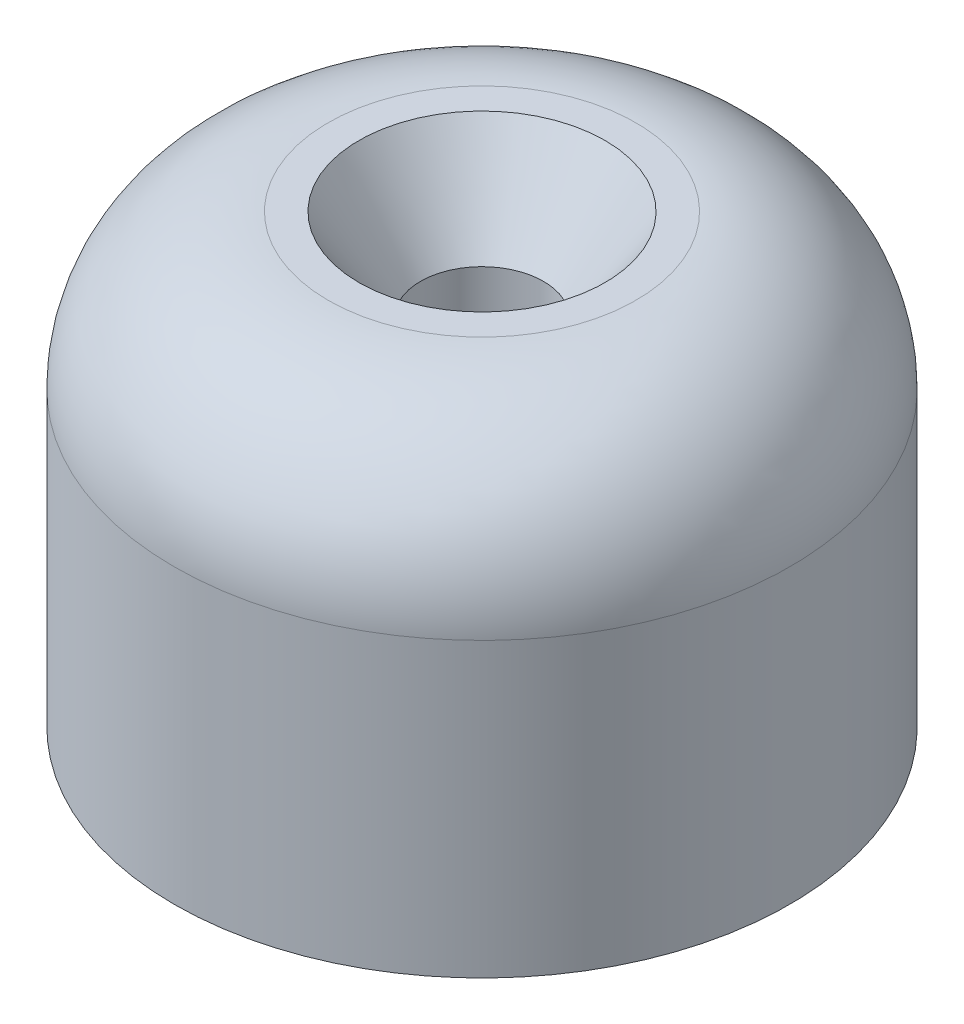
ISO-10303-21;
HEADER;
FILE_DESCRIPTION(('STEP AP214'),'2;1');
FILE_NAME('part.step','',(''),(''),'','','');
FILE_SCHEMA(('AUTOMOTIVE_DESIGN { 1 0 10303 214 1 1 1 1 }'));
ENDSEC;
DATA;
#1=APPLICATION_CONTEXT('core data for automotive mechanical design processes');
#2=APPLICATION_PROTOCOL_DEFINITION('international standard','automotive_design',2000,#1);
#3=PRODUCT_CONTEXT('',#1,'mechanical');
#4=PRODUCT('Part','Part','',(#3));
#5=PRODUCT_RELATED_PRODUCT_CATEGORY('part','',(#4));
#6=PRODUCT_DEFINITION_FORMATION('','',#4);
#7=PRODUCT_DEFINITION_CONTEXT('part definition',#1,'design');
#8=PRODUCT_DEFINITION('design','',#6,#7);
#9=PRODUCT_DEFINITION_SHAPE('','',#8);
#10=(LENGTH_UNIT() NAMED_UNIT(*) SI_UNIT(.MILLI.,.METRE.));
#11=(NAMED_UNIT(*) PLANE_ANGLE_UNIT() SI_UNIT($,.RADIAN.));
#12=(NAMED_UNIT(*) SI_UNIT($,.STERADIAN.) SOLID_ANGLE_UNIT());
#13=UNCERTAINTY_MEASURE_WITH_UNIT(LENGTH_MEASURE(1.E-05),#10,'distance_accuracy_value','');
#14=(GEOMETRIC_REPRESENTATION_CONTEXT(3) GLOBAL_UNCERTAINTY_ASSIGNED_CONTEXT((#13)) GLOBAL_UNIT_ASSIGNED_CONTEXT((#10,
#11,#12)) REPRESENTATION_CONTEXT('',''));
#15=CARTESIAN_POINT('',(0.,0.,0.));
#16=DIRECTION('',(0.,0.,1.));
#17=DIRECTION('',(1.,0.,0.));
#18=AXIS2_PLACEMENT_3D('',#15,#16,#17);
#19=CARTESIAN_POINT('',(0.,0.,0.));
#20=DIRECTION('',(0.,1.,0.));
#21=DIRECTION('',(0.,0.,1.));
#22=AXIS2_PLACEMENT_3D('',#19,#20,#21);
#23=PLANE('',#22);
#24=CARTESIAN_POINT('',(0.,0.,0.));
#25=DIRECTION('',(0.,1.,0.));
#26=DIRECTION('',(0.,0.,1.));
#27=AXIS2_PLACEMENT_3D('',#24,#25,#26);
#28=CIRCLE('',#27,2.);
#29=CARTESIAN_POINT('',(0.,0.,2.));
#30=VERTEX_POINT('',#29);
#31=EDGE_CURVE('E61',#30,#30,#28,.T.);
#32=ORIENTED_EDGE('',*,*,#31,.T.);
#33=EDGE_LOOP('',(#32));
#34=FACE_BOUND('',#33,.T.);
#35=CARTESIAN_POINT('',(0.,0.,0.));
#36=DIRECTION('',(0.,-1.,0.));
#37=DIRECTION('',(0.,0.,-1.));
#38=AXIS2_PLACEMENT_3D('',#35,#36,#37);
#39=CIRCLE('',#38,4.125);
#40=CARTESIAN_POINT('',(0.,0.,-4.125));
#41=VERTEX_POINT('',#40);
#42=EDGE_CURVE('E66',#41,#41,#39,.T.);
#43=ORIENTED_EDGE('',*,*,#42,.T.);
#44=EDGE_LOOP('',(#43));
#45=FACE_BOUND('',#44,.T.);
#46=ADVANCED_FACE('F37',(#34,#45),#23,.F.);
#47=CARTESIAN_POINT('',(0.,7.5,0.));
#48=DIRECTION('',(0.,1.,0.));
#49=DIRECTION('',(0.,0.,1.));
#50=AXIS2_PLACEMENT_3D('',#47,#48,#49);
#51=PLANE('',#50);
#52=CARTESIAN_POINT('',(0.,7.5,0.));
#53=DIRECTION('',(0.,1.,0.));
#54=DIRECTION('',(0.,0.,1.));
#55=AXIS2_PLACEMENT_3D('',#52,#53,#54);
#56=CIRCLE('',#55,5.);
#57=CARTESIAN_POINT('',(0.,7.5,5.));
#58=VERTEX_POINT('',#57);
#59=EDGE_CURVE('E55',#58,#58,#56,.T.);
#60=ORIENTED_EDGE('',*,*,#59,.T.);
#61=EDGE_LOOP('',(#60));
#62=FACE_BOUND('',#61,.T.);
#63=CARTESIAN_POINT('',(0.,7.5,0.));
#64=DIRECTION('',(0.,1.,0.));
#65=DIRECTION('',(0.,0.,1.));
#66=AXIS2_PLACEMENT_3D('',#63,#64,#65);
#67=CIRCLE('',#66,4.);
#68=CARTESIAN_POINT('',(0.,7.5,4.));
#69=VERTEX_POINT('',#68);
#70=EDGE_CURVE('E67',#69,#69,#67,.T.);
#71=ORIENTED_EDGE('',*,*,#70,.F.);
#72=EDGE_LOOP('',(#71));
#73=FACE_BOUND('',#72,.T.);
#74=ADVANCED_FACE('F84',(#62,#73),#51,.T.);
#75=CARTESIAN_POINT('',(0.,7.5,0.));
#76=DIRECTION('',(0.,-1.,0.));
#77=DIRECTION('',(0.,0.,-1.));
#78=AXIS2_PLACEMENT_3D('',#75,#76,#77);
#79=CYLINDRICAL_SURFACE('',#78,10.);
#80=CARTESIAN_POINT('',(0.,2.5,0.));
#81=DIRECTION('',(0.,1.,0.));
#82=DIRECTION('',(0.,0.,1.));
#83=AXIS2_PLACEMENT_3D('',#80,#81,#82);
#84=CIRCLE('',#83,10.);
#85=CARTESIAN_POINT('',(0.,2.5,10.));
#86=VERTEX_POINT('',#85);
#87=EDGE_CURVE('E50',#86,#86,#84,.F.);
#88=ORIENTED_EDGE('',*,*,#87,.T.);
#89=EDGE_LOOP('',(#88));
#90=FACE_BOUND('',#89,.T.);
#91=CARTESIAN_POINT('',(0.,-7.,0.));
#92=DIRECTION('',(0.,-1.,0.));
#93=DIRECTION('',(0.,0.,-1.));
#94=AXIS2_PLACEMENT_3D('',#91,#92,#93);
#95=CIRCLE('',#94,10.);
#96=CARTESIAN_POINT('',(0.,-7.,-10.));
#97=VERTEX_POINT('',#96);
#98=EDGE_CURVE('E71',#97,#97,#95,.T.);
#99=ORIENTED_EDGE('',*,*,#98,.F.);
#100=EDGE_LOOP('',(#99));
#101=FACE_BOUND('',#100,.T.);
#102=ADVANCED_FACE('F86',(#90,#101),#79,.T.);
#103=CARTESIAN_POINT('',(0.,7.5,0.));
#104=DIRECTION('',(0.,-1.,0.));
#105=DIRECTION('',(0.,0.,-1.));
#106=AXIS2_PLACEMENT_3D('',#103,#104,#105);
#107=CYLINDRICAL_SURFACE('',#106,2.);
#108=CARTESIAN_POINT('',(0.,4.53487806297453,0.));
#109=DIRECTION('',(0.,1.,0.));
#110=DIRECTION('',(0.,0.,1.));
#111=AXIS2_PLACEMENT_3D('',#108,#109,#110);
#112=CIRCLE('',#111,2.);
#113=CARTESIAN_POINT('',(0.,4.53487806297453,2.));
#114=VERTEX_POINT('',#113);
#115=EDGE_CURVE('E62',#114,#114,#112,.F.);
#116=ORIENTED_EDGE('',*,*,#115,.F.);
#117=EDGE_LOOP('',(#116));
#118=FACE_BOUND('',#117,.T.);
#119=ORIENTED_EDGE('',*,*,#31,.F.);
#120=EDGE_LOOP('',(#119));
#121=FACE_BOUND('',#120,.T.);
#122=ADVANCED_FACE('F93',(#118,#121),#107,.F.);
#123=CARTESIAN_POINT('',(0.,-7.,0.));
#124=DIRECTION('',(0.,-1.,0.));
#125=DIRECTION('',(0.,0.,-1.));
#126=AXIS2_PLACEMENT_3D('',#123,#124,#125);
#127=PLANE('',#126);
#128=CARTESIAN_POINT('',(0.,-7.,0.));
#129=DIRECTION('',(0.,-1.,0.));
#130=DIRECTION('',(0.,0.,-1.));
#131=AXIS2_PLACEMENT_3D('',#128,#129,#130);
#132=CIRCLE('',#131,5.125);
#133=CARTESIAN_POINT('',(0.,-7.,-5.125));
#134=VERTEX_POINT('',#133);
#135=EDGE_CURVE('E10',#134,#134,#132,.F.);
#136=ORIENTED_EDGE('',*,*,#135,.T.);
#137=EDGE_LOOP('',(#136));
#138=FACE_BOUND('',#137,.T.);
#139=ORIENTED_EDGE('',*,*,#98,.T.);
#140=EDGE_LOOP('',(#139));
#141=FACE_BOUND('',#140,.T.);
#142=ADVANCED_FACE('F117',(#138,#141),#127,.T.);
#143=CARTESIAN_POINT('',(0.,-7.,0.));
#144=DIRECTION('',(0.,1.,0.));
#145=DIRECTION('',(0.,0.,1.));
#146=AXIS2_PLACEMENT_3D('',#143,#144,#145);
#147=CYLINDRICAL_SURFACE('',#146,4.125);
#148=CARTESIAN_POINT('',(0.,-6.,0.));
#149=DIRECTION('',(0.,-1.,0.));
#150=DIRECTION('',(0.,0.,-1.));
#151=AXIS2_PLACEMENT_3D('',#148,#149,#150);
#152=CIRCLE('',#151,4.125);
#153=CARTESIAN_POINT('',(0.,-6.,-4.125));
#154=VERTEX_POINT('',#153);
#155=EDGE_CURVE('E45',#154,#154,#152,.T.);
#156=ORIENTED_EDGE('',*,*,#155,.T.);
#157=EDGE_LOOP('',(#156));
#158=FACE_BOUND('',#157,.T.);
#159=ORIENTED_EDGE('',*,*,#42,.F.);
#160=EDGE_LOOP('',(#159));
#161=FACE_BOUND('',#160,.T.);
#162=ADVANCED_FACE('F108',(#158,#161),#147,.F.);
#163=CARTESIAN_POINT('',(0.,7.5,0.));
#164=DIRECTION('',(0.,1.,0.));
#165=DIRECTION('',(0.,0.,1.));
#166=AXIS2_PLACEMENT_3D('',#163,#164,#165);
#167=CONICAL_SURFACE('',#166,4.,0.593411945678073);
#168=ORIENTED_EDGE('',*,*,#115,.T.);
#169=EDGE_LOOP('',(#168));
#170=FACE_BOUND('',#169,.T.);
#171=ORIENTED_EDGE('',*,*,#70,.T.);
#172=EDGE_LOOP('',(#171));
#173=FACE_BOUND('',#172,.T.);
#174=ADVANCED_FACE('F82',(#170,#173),#167,.F.);
#175=CARTESIAN_POINT('',(0.,2.5,0.));
#176=DIRECTION('',(0.,1.,0.));
#177=DIRECTION('',(0.,0.,1.));
#178=AXIS2_PLACEMENT_3D('',#175,#176,#177);
#179=DEGENERATE_TOROIDAL_SURFACE('',#178,5.,5.,.T.);
#180=ORIENTED_EDGE('',*,*,#87,.F.);
#181=EDGE_LOOP('',(#180));
#182=FACE_BOUND('',#181,.T.);
#183=ORIENTED_EDGE('',*,*,#59,.F.);
#184=EDGE_LOOP('',(#183));
#185=FACE_BOUND('',#184,.T.);
#186=ADVANCED_FACE('F100',(#182,#185),#179,.T.);
#187=CARTESIAN_POINT('',(0.,-6.,0.));
#188=DIRECTION('',(0.,-1.,0.));
#189=DIRECTION('',(0.,0.,-1.));
#190=AXIS2_PLACEMENT_3D('',#187,#188,#189);
#191=TOROIDAL_SURFACE('',#190,5.125,1.);
#192=ORIENTED_EDGE('',*,*,#135,.F.);
#193=EDGE_LOOP('',(#192));
#194=FACE_BOUND('',#193,.T.);
#195=ORIENTED_EDGE('',*,*,#155,.F.);
#196=EDGE_LOOP('',(#195));
#197=FACE_BOUND('',#196,.T.);
#198=ADVANCED_FACE('F39',(#194,#197),#191,.T.);
#199=CLOSED_SHELL('',(#46,#74,#102,#122,#142,#162,#174,#186,#198));
#200=MANIFOLD_SOLID_BREP('B2',#199);
#201=ADVANCED_BREP_SHAPE_REPRESENTATION('',(#18,#200),#14);
#202=SHAPE_DEFINITION_REPRESENTATION(#9,#201);
ENDSEC;
END-ISO-10303-21;
